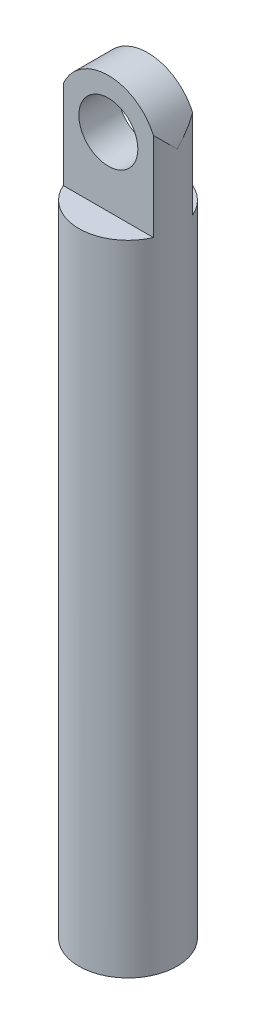
ISO-10303-21;
HEADER;
FILE_DESCRIPTION(('STEP AP214'),'2;1');
FILE_NAME('part.step','',(''),(''),'','','');
FILE_SCHEMA(('AUTOMOTIVE_DESIGN { 1 0 10303 214 1 1 1 1 }'));
ENDSEC;
DATA;
#1=APPLICATION_CONTEXT('core data for automotive mechanical design processes');
#2=APPLICATION_PROTOCOL_DEFINITION('international standard','automotive_design',2000,#1);
#3=PRODUCT_CONTEXT('',#1,'mechanical');
#4=PRODUCT('Part','Part','',(#3));
#5=PRODUCT_RELATED_PRODUCT_CATEGORY('part','',(#4));
#6=PRODUCT_DEFINITION_FORMATION('','',#4);
#7=PRODUCT_DEFINITION_CONTEXT('part definition',#1,'design');
#8=PRODUCT_DEFINITION('design','',#6,#7);
#9=PRODUCT_DEFINITION_SHAPE('','',#8);
#10=(LENGTH_UNIT() NAMED_UNIT(*) SI_UNIT(.MILLI.,.METRE.));
#11=(NAMED_UNIT(*) PLANE_ANGLE_UNIT() SI_UNIT($,.RADIAN.));
#12=(NAMED_UNIT(*) SI_UNIT($,.STERADIAN.) SOLID_ANGLE_UNIT());
#13=UNCERTAINTY_MEASURE_WITH_UNIT(LENGTH_MEASURE(1.E-05),#10,'distance_accuracy_value','');
#14=(GEOMETRIC_REPRESENTATION_CONTEXT(3) GLOBAL_UNCERTAINTY_ASSIGNED_CONTEXT((#13)) GLOBAL_UNIT_ASSIGNED_CONTEXT((#10,
#11,#12)) REPRESENTATION_CONTEXT('',''));
#15=CARTESIAN_POINT('',(0.,0.,0.));
#16=DIRECTION('',(0.,0.,1.));
#17=DIRECTION('',(1.,0.,0.));
#18=AXIS2_PLACEMENT_3D('',#15,#16,#17);
#19=CARTESIAN_POINT('',(0.,38.5,0.));
#20=DIRECTION('',(0.,-1.,0.));
#21=DIRECTION('',(0.,0.,-1.));
#22=AXIS2_PLACEMENT_3D('',#19,#20,#21);
#23=CYLINDRICAL_SURFACE('',#22,2.5);
#24=CARTESIAN_POINT('',(0.,36.,0.));
#25=DIRECTION('',(0.,-0.707106781186547,0.707106781186547));
#26=DIRECTION('',(0.,-0.707106781186547,-0.707106781186547));
#27=AXIS2_PLACEMENT_3D('',#24,#25,#26);
#28=ELLIPSE('',#27,3.53553390593274,2.5);
#29=CARTESIAN_POINT('',(2.5,36.,0.));
#30=VERTEX_POINT('',#29);
#31=CARTESIAN_POINT('',(2.29128784747792,37.,1.));
#32=VERTEX_POINT('',#31);
#33=EDGE_CURVE('E211',#30,#32,#28,.T.);
#34=ORIENTED_EDGE('',*,*,#33,.T.);
#35=DIRECTION('',(0.,-1.,0.));
#36=VECTOR('',#35,1.);
#37=CARTESIAN_POINT('',(2.29128784747792,38.5,1.));
#38=LINE('',#37,#36);
#39=CARTESIAN_POINT('',(2.29128784747792,32.5,0.999999999999999));
#40=VERTEX_POINT('',#39);
#41=EDGE_CURVE('E204',#32,#40,#38,.T.);
#42=ORIENTED_EDGE('',*,*,#41,.T.);
#43=CARTESIAN_POINT('',(0.,32.5,0.));
#44=DIRECTION('',(0.,-1.,0.));
#45=DIRECTION('',(0.,0.,-1.));
#46=AXIS2_PLACEMENT_3D('',#43,#44,#45);
#47=CIRCLE('',#46,2.5);
#48=CARTESIAN_POINT('',(-2.29128784747792,32.5,0.999999999999999));
#49=VERTEX_POINT('',#48);
#50=EDGE_CURVE('E12',#40,#49,#47,.T.);
#51=ORIENTED_EDGE('',*,*,#50,.T.);
#52=DIRECTION('',(0.,-1.,0.));
#53=VECTOR('',#52,1.);
#54=CARTESIAN_POINT('',(-2.29128784747792,38.5,1.));
#55=LINE('',#54,#53);
#56=CARTESIAN_POINT('',(-2.29128784747792,37.,1.));
#57=VERTEX_POINT('',#56);
#58=EDGE_CURVE('E201',#49,#57,#55,.F.);
#59=ORIENTED_EDGE('',*,*,#58,.T.);
#60=CARTESIAN_POINT('',(-2.5,36.,0.));
#61=VERTEX_POINT('',#60);
#62=EDGE_CURVE('E146',#57,#61,#28,.T.);
#63=ORIENTED_EDGE('',*,*,#62,.T.);
#64=CARTESIAN_POINT('',(0.,36.,0.));
#65=DIRECTION('',(0.,-0.707106781186547,-0.707106781186547));
#66=DIRECTION('',(0.,-0.707106781186547,0.707106781186547));
#67=AXIS2_PLACEMENT_3D('',#64,#65,#66);
#68=ELLIPSE('',#67,3.53553390593274,2.5);
#69=CARTESIAN_POINT('',(-2.29128784747792,37.,-1.00000000000001));
#70=VERTEX_POINT('',#69);
#71=EDGE_CURVE('E185',#61,#70,#68,.T.);
#72=ORIENTED_EDGE('',*,*,#71,.T.);
#73=DIRECTION('',(0.,-1.,0.));
#74=VECTOR('',#73,1.);
#75=CARTESIAN_POINT('',(-2.29128784747792,38.5,-1.00000000000001));
#76=LINE('',#75,#74);
#77=CARTESIAN_POINT('',(-2.29128784747792,32.5,-1.00000000000001));
#78=VERTEX_POINT('',#77);
#79=EDGE_CURVE('E138',#70,#78,#76,.T.);
#80=ORIENTED_EDGE('',*,*,#79,.T.);
#81=CARTESIAN_POINT('',(0.,32.5,0.));
#82=DIRECTION('',(0.,-1.,0.));
#83=DIRECTION('',(0.,0.,-1.));
#84=AXIS2_PLACEMENT_3D('',#81,#82,#83);
#85=CIRCLE('',#84,2.5);
#86=CARTESIAN_POINT('',(2.29128784747792,32.5,-1.00000000000001));
#87=VERTEX_POINT('',#86);
#88=EDGE_CURVE('E131',#78,#87,#85,.T.);
#89=ORIENTED_EDGE('',*,*,#88,.T.);
#90=DIRECTION('',(0.,-1.,0.));
#91=VECTOR('',#90,1.);
#92=CARTESIAN_POINT('',(2.29128784747792,38.5,-1.00000000000001));
#93=LINE('',#92,#91);
#94=CARTESIAN_POINT('',(2.29128784747792,37.,-1.00000000000001));
#95=VERTEX_POINT('',#94);
#96=EDGE_CURVE('E179',#87,#95,#93,.F.);
#97=ORIENTED_EDGE('',*,*,#96,.T.);
#98=EDGE_CURVE('E208',#95,#30,#68,.T.);
#99=ORIENTED_EDGE('',*,*,#98,.T.);
#100=EDGE_LOOP('',(#34,#42,#51,#59,#63,#72,#80,#89,#97,#99));
#101=FACE_BOUND('',#100,.T.);
#102=CARTESIAN_POINT('',(0.,0.,0.));
#103=DIRECTION('',(0.,1.,0.));
#104=DIRECTION('',(0.,0.,1.));
#105=AXIS2_PLACEMENT_3D('',#102,#103,#104);
#106=CIRCLE('',#105,2.5);
#107=CARTESIAN_POINT('',(0.,0.,2.5));
#108=VERTEX_POINT('',#107);
#109=EDGE_CURVE('E177',#108,#108,#106,.T.);
#110=ORIENTED_EDGE('',*,*,#109,.T.);
#111=EDGE_LOOP('',(#110));
#112=FACE_BOUND('',#111,.T.);
#113=ADVANCED_FACE('F123',(#101,#112),#23,.T.);
#114=CARTESIAN_POINT('',(0.,0.,0.));
#115=DIRECTION('',(0.,1.,0.));
#116=DIRECTION('',(0.,0.,1.));
#117=AXIS2_PLACEMENT_3D('',#114,#115,#116);
#118=PLANE('',#117);
#119=ORIENTED_EDGE('',*,*,#109,.F.);
#120=EDGE_LOOP('',(#119));
#121=FACE_BOUND('',#120,.T.);
#122=ADVANCED_FACE('F237',(#121),#118,.F.);
#123=CARTESIAN_POINT('',(0.,36.,-2.5));
#124=DIRECTION('',(0.,0.,1.));
#125=DIRECTION('',(1.,0.,0.));
#126=AXIS2_PLACEMENT_3D('',#123,#124,#125);
#127=CYLINDRICAL_SURFACE('',#126,2.5);
#128=ORIENTED_EDGE('',*,*,#62,.F.);
#129=CARTESIAN_POINT('',(0.,36.,1.));
#130=DIRECTION('',(0.,0.,-1.));
#131=DIRECTION('',(0.,1.,0.));
#132=AXIS2_PLACEMENT_3D('',#129,#130,#131);
#133=CIRCLE('',#132,2.5);
#134=EDGE_CURVE('E192',#57,#32,#133,.T.);
#135=ORIENTED_EDGE('',*,*,#134,.T.);
#136=ORIENTED_EDGE('',*,*,#33,.F.);
#137=ORIENTED_EDGE('',*,*,#98,.F.);
#138=CARTESIAN_POINT('',(0.,36.,-1.00000000000001));
#139=DIRECTION('',(0.,0.,1.));
#140=DIRECTION('',(0.,-1.,0.));
#141=AXIS2_PLACEMENT_3D('',#138,#139,#140);
#142=CIRCLE('',#141,2.5);
#143=EDGE_CURVE('E194',#95,#70,#142,.T.);
#144=ORIENTED_EDGE('',*,*,#143,.T.);
#145=ORIENTED_EDGE('',*,*,#71,.F.);
#146=EDGE_LOOP('',(#128,#135,#136,#137,#144,#145));
#147=FACE_BOUND('',#146,.T.);
#148=ADVANCED_FACE('F233',(#147),#127,.T.);
#149=CARTESIAN_POINT('',(-2.5,32.5,-2.50000000000001));
#150=DIRECTION('',(0.,-1.,0.));
#151=DIRECTION('',(0.,0.,-1.));
#152=AXIS2_PLACEMENT_3D('',#149,#150,#151);
#153=PLANE('',#152);
#154=ORIENTED_EDGE('',*,*,#88,.F.);
#155=DIRECTION('',(1.,0.,0.));
#156=VECTOR('',#155,1.);
#157=CARTESIAN_POINT('',(-2.5,32.5,-1.00000000000001));
#158=LINE('',#157,#156);
#159=EDGE_CURVE('E174',#78,#87,#158,.T.);
#160=ORIENTED_EDGE('',*,*,#159,.T.);
#161=EDGE_LOOP('',(#154,#160));
#162=FACE_BOUND('',#161,.T.);
#163=ADVANCED_FACE('F173',(#162),#153,.F.);
#164=CARTESIAN_POINT('',(-2.5,38.5,-1.00000000000001));
#165=DIRECTION('',(0.,0.,1.));
#166=DIRECTION('',(0.,-1.,0.));
#167=AXIS2_PLACEMENT_3D('',#164,#165,#166);
#168=PLANE('',#167);
#169=CARTESIAN_POINT('',(0.,36.,-1.00000000000001));
#170=DIRECTION('',(0.,0.,1.));
#171=DIRECTION('',(0.,-1.,0.));
#172=AXIS2_PLACEMENT_3D('',#169,#170,#171);
#173=CIRCLE('',#172,1.5);
#174=CARTESIAN_POINT('',(0.,34.5,-1.00000000000001));
#175=VERTEX_POINT('',#174);
#176=EDGE_CURVE('E217',#175,#175,#173,.F.);
#177=ORIENTED_EDGE('',*,*,#176,.F.);
#178=EDGE_LOOP('',(#177));
#179=FACE_BOUND('',#178,.T.);
#180=ORIENTED_EDGE('',*,*,#143,.F.);
#181=ORIENTED_EDGE('',*,*,#96,.F.);
#182=ORIENTED_EDGE('',*,*,#159,.F.);
#183=ORIENTED_EDGE('',*,*,#79,.F.);
#184=EDGE_LOOP('',(#180,#181,#182,#183));
#185=FACE_BOUND('',#184,.T.);
#186=ADVANCED_FACE('F178',(#179,#185),#168,.F.);
#187=CARTESIAN_POINT('',(-2.5,32.5,2.5));
#188=DIRECTION('',(0.,-1.,0.));
#189=DIRECTION('',(0.,0.,-1.));
#190=AXIS2_PLACEMENT_3D('',#187,#188,#189);
#191=PLANE('',#190);
#192=DIRECTION('',(1.,0.,0.));
#193=VECTOR('',#192,1.);
#194=CARTESIAN_POINT('',(-2.5,32.5,0.999999999999999));
#195=LINE('',#194,#193);
#196=EDGE_CURVE('E181',#49,#40,#195,.T.);
#197=ORIENTED_EDGE('',*,*,#196,.F.);
#198=ORIENTED_EDGE('',*,*,#50,.F.);
#199=EDGE_LOOP('',(#197,#198));
#200=FACE_BOUND('',#199,.T.);
#201=ADVANCED_FACE('F286',(#200),#191,.F.);
#202=CARTESIAN_POINT('',(-2.5,38.5,1.));
#203=DIRECTION('',(0.,0.,-1.));
#204=DIRECTION('',(0.,1.,0.));
#205=AXIS2_PLACEMENT_3D('',#202,#203,#204);
#206=PLANE('',#205);
#207=CARTESIAN_POINT('',(0.,36.,1.));
#208=DIRECTION('',(0.,0.,-1.));
#209=DIRECTION('',(0.,1.,0.));
#210=AXIS2_PLACEMENT_3D('',#207,#208,#209);
#211=CIRCLE('',#210,1.5);
#212=CARTESIAN_POINT('',(0.,37.5,1.));
#213=VERTEX_POINT('',#212);
#214=EDGE_CURVE('E187',#213,#213,#211,.F.);
#215=ORIENTED_EDGE('',*,*,#214,.F.);
#216=EDGE_LOOP('',(#215));
#217=FACE_BOUND('',#216,.T.);
#218=ORIENTED_EDGE('',*,*,#134,.F.);
#219=ORIENTED_EDGE('',*,*,#58,.F.);
#220=ORIENTED_EDGE('',*,*,#196,.T.);
#221=ORIENTED_EDGE('',*,*,#41,.F.);
#222=EDGE_LOOP('',(#218,#219,#220,#221));
#223=FACE_BOUND('',#222,.T.);
#224=ADVANCED_FACE('F228',(#217,#223),#206,.F.);
#225=CARTESIAN_POINT('',(0.,36.,-2.5));
#226=DIRECTION('',(0.,0.,1.));
#227=DIRECTION('',(1.,0.,0.));
#228=AXIS2_PLACEMENT_3D('',#225,#226,#227);
#229=CYLINDRICAL_SURFACE('',#228,1.5);
#230=ORIENTED_EDGE('',*,*,#214,.T.);
#231=EDGE_LOOP('',(#230));
#232=FACE_BOUND('',#231,.T.);
#233=ORIENTED_EDGE('',*,*,#176,.T.);
#234=EDGE_LOOP('',(#233));
#235=FACE_BOUND('',#234,.T.);
#236=ADVANCED_FACE('F268',(#232,#235),#229,.F.);
#237=CLOSED_SHELL('',(#113,#122,#148,#163,#186,#201,#224,#236));
#238=MANIFOLD_SOLID_BREP('B2',#237);
#239=ADVANCED_BREP_SHAPE_REPRESENTATION('',(#18,#238),#14);
#240=SHAPE_DEFINITION_REPRESENTATION(#9,#239);
ENDSEC;
END-ISO-10303-21;
